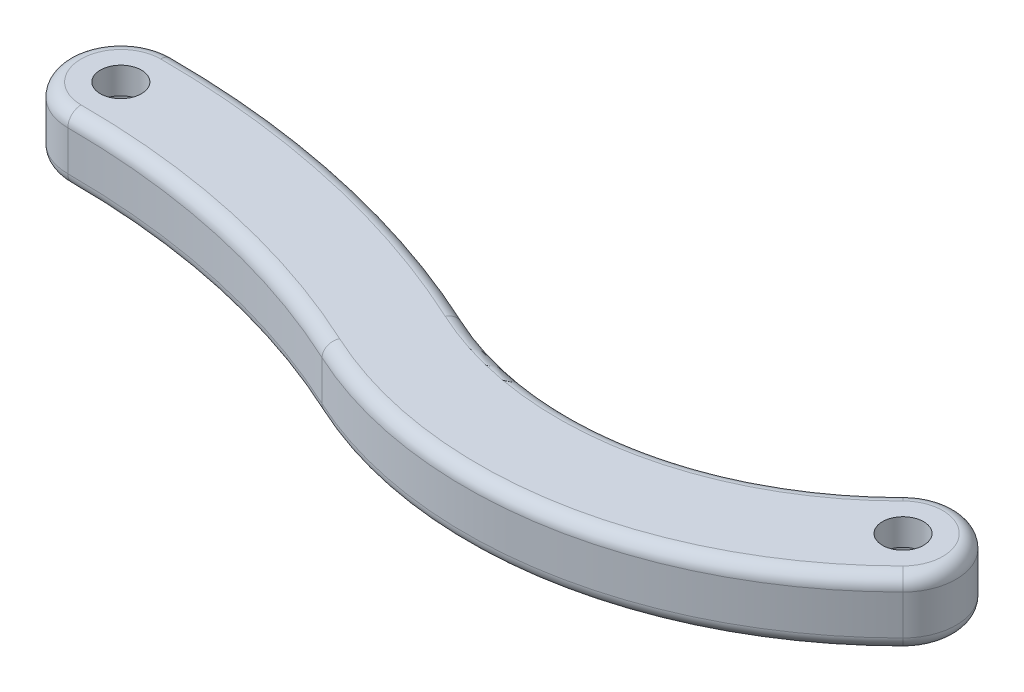
ISO-10303-21;
HEADER;
FILE_DESCRIPTION(('STEP AP214'),'2;1');
FILE_NAME('part.step','',(''),(''),'','','');
FILE_SCHEMA(('AUTOMOTIVE_DESIGN { 1 0 10303 214 1 1 1 1 }'));
ENDSEC;
DATA;
#1=APPLICATION_CONTEXT('core data for automotive mechanical design processes');
#2=APPLICATION_PROTOCOL_DEFINITION('international standard','automotive_design',2000,#1);
#3=PRODUCT_CONTEXT('',#1,'mechanical');
#4=PRODUCT('Part','Part','',(#3));
#5=PRODUCT_RELATED_PRODUCT_CATEGORY('part','',(#4));
#6=PRODUCT_DEFINITION_FORMATION('','',#4);
#7=PRODUCT_DEFINITION_CONTEXT('part definition',#1,'design');
#8=PRODUCT_DEFINITION('design','',#6,#7);
#9=PRODUCT_DEFINITION_SHAPE('','',#8);
#10=(LENGTH_UNIT() NAMED_UNIT(*) SI_UNIT(.MILLI.,.METRE.));
#11=(NAMED_UNIT(*) PLANE_ANGLE_UNIT() SI_UNIT($,.RADIAN.));
#12=(NAMED_UNIT(*) SI_UNIT($,.STERADIAN.) SOLID_ANGLE_UNIT());
#13=UNCERTAINTY_MEASURE_WITH_UNIT(LENGTH_MEASURE(1.E-05),#10,'distance_accuracy_value','');
#14=(GEOMETRIC_REPRESENTATION_CONTEXT(3) GLOBAL_UNCERTAINTY_ASSIGNED_CONTEXT((#13)) GLOBAL_UNIT_ASSIGNED_CONTEXT((#10,
#11,#12)) REPRESENTATION_CONTEXT('',''));
#15=CARTESIAN_POINT('',(0.,0.,0.));
#16=DIRECTION('',(0.,0.,1.));
#17=DIRECTION('',(1.,0.,0.));
#18=AXIS2_PLACEMENT_3D('',#15,#16,#17);
#19=CARTESIAN_POINT('',(-29.5,5.,0.));
#20=DIRECTION('',(0.,-1.,0.));
#21=DIRECTION('',(0.,0.,-1.));
#22=AXIS2_PLACEMENT_3D('',#19,#20,#21);
#23=CYLINDRICAL_SURFACE('',#22,1.55);
#24=CARTESIAN_POINT('',(-29.5,5.,0.));
#25=DIRECTION('',(0.,1.,0.));
#26=DIRECTION('',(0.,0.,1.));
#27=AXIS2_PLACEMENT_3D('',#24,#25,#26);
#28=CIRCLE('',#27,1.55);
#29=CARTESIAN_POINT('',(-29.5,5.,1.55));
#30=VERTEX_POINT('',#29);
#31=EDGE_CURVE('E237',#30,#30,#28,.T.);
#32=ORIENTED_EDGE('',*,*,#31,.T.);
#33=EDGE_LOOP('',(#32));
#34=FACE_BOUND('',#33,.T.);
#35=CARTESIAN_POINT('',(-29.5,3.,0.));
#36=DIRECTION('',(0.,-1.,0.));
#37=DIRECTION('',(0.,0.,-1.));
#38=AXIS2_PLACEMENT_3D('',#35,#36,#37);
#39=CIRCLE('',#38,1.55);
#40=CARTESIAN_POINT('',(-29.5,3.,-1.55));
#41=VERTEX_POINT('',#40);
#42=EDGE_CURVE('E37',#41,#41,#39,.T.);
#43=ORIENTED_EDGE('',*,*,#42,.T.);
#44=EDGE_LOOP('',(#43));
#45=FACE_BOUND('',#44,.T.);
#46=ADVANCED_FACE('F33',(#34,#45),#23,.F.);
#47=CARTESIAN_POINT('',(29.5,5.,0.));
#48=DIRECTION('',(0.,-1.,0.));
#49=DIRECTION('',(0.,0.,-1.));
#50=AXIS2_PLACEMENT_3D('',#47,#48,#49);
#51=CYLINDRICAL_SURFACE('',#50,1.55);
#52=CARTESIAN_POINT('',(29.5,5.,0.));
#53=DIRECTION('',(0.,1.,0.));
#54=DIRECTION('',(0.,0.,1.));
#55=AXIS2_PLACEMENT_3D('',#52,#53,#54);
#56=CIRCLE('',#55,1.55);
#57=CARTESIAN_POINT('',(29.5,5.,1.55));
#58=VERTEX_POINT('',#57);
#59=EDGE_CURVE('E201',#58,#58,#56,.T.);
#60=ORIENTED_EDGE('',*,*,#59,.T.);
#61=EDGE_LOOP('',(#60));
#62=FACE_BOUND('',#61,.T.);
#63=CARTESIAN_POINT('',(29.5,3.,0.));
#64=DIRECTION('',(0.,-1.,0.));
#65=DIRECTION('',(0.,0.,-1.));
#66=AXIS2_PLACEMENT_3D('',#63,#64,#65);
#67=CIRCLE('',#66,1.55);
#68=CARTESIAN_POINT('',(29.5,3.,-1.55));
#69=VERTEX_POINT('',#68);
#70=EDGE_CURVE('E215',#69,#69,#67,.T.);
#71=ORIENTED_EDGE('',*,*,#70,.T.);
#72=EDGE_LOOP('',(#71));
#73=FACE_BOUND('',#72,.T.);
#74=ADVANCED_FACE('F325',(#62,#73),#51,.F.);
#75=CARTESIAN_POINT('',(-10.253048327205,5.,20.9834913295184));
#76=DIRECTION('',(0.,-1.,0.));
#77=DIRECTION('',(0.,0.,-1.));
#78=AXIS2_PLACEMENT_3D('',#75,#76,#77);
#79=PLANE('',#78);
#80=CARTESIAN_POINT('',(8.99390334559,5.,-20.5060966544098));
#81=DIRECTION('',(0.,-1.,0.));
#82=DIRECTION('',(0.,0.,-1.));
#83=AXIS2_PLACEMENT_3D('',#80,#81,#82);
#84=CIRCLE('',#83,32.);
#85=CARTESIAN_POINT('',(-4.47240735810798,5.,8.52248367655837));
#86=VERTEX_POINT('',#85);
#87=CARTESIAN_POINT('',(31.6213203435597,5.,2.12132034355962));
#88=VERTEX_POINT('',#87);
#89=EDGE_CURVE('E151',#86,#88,#84,.F.);
#90=ORIENTED_EDGE('',*,*,#89,.T.);
#91=CARTESIAN_POINT('',(29.5,5.,0.));
#92=DIRECTION('',(0.,-1.,0.));
#93=DIRECTION('',(0.,0.,-1.));
#94=AXIS2_PLACEMENT_3D('',#91,#92,#93);
#95=CIRCLE('',#94,3.);
#96=CARTESIAN_POINT('',(27.3786796564403,5.,-2.12132034355963));
#97=VERTEX_POINT('',#96);
#98=EDGE_CURVE('E130',#88,#97,#95,.F.);
#99=ORIENTED_EDGE('',*,*,#98,.T.);
#100=CARTESIAN_POINT('',(8.99390334558998,5.,-20.5060966544098));
#101=DIRECTION('',(0.,-1.,0.));
#102=DIRECTION('',(0.,0.,-1.));
#103=AXIS2_PLACEMENT_3D('',#100,#101,#102);
#104=CIRCLE('',#103,26.);
#105=CARTESIAN_POINT('',(-1.94747410116464,5.,3.07962486450185));
#106=VERTEX_POINT('',#105);
#107=EDGE_CURVE('E139',#97,#106,#104,.T.);
#108=ORIENTED_EDGE('',*,*,#107,.T.);
#109=CARTESIAN_POINT('',(-29.5,5.,62.4730793134467));
#110=DIRECTION('',(0.,-1.,0.));
#111=DIRECTION('',(0.,0.,-1.));
#112=AXIS2_PLACEMENT_3D('',#109,#110,#111);
#113=CIRCLE('',#112,65.4730793134467);
#114=CARTESIAN_POINT('',(-29.5,5.,-3.));
#115=VERTEX_POINT('',#114);
#116=EDGE_CURVE('E145',#106,#115,#113,.F.);
#117=ORIENTED_EDGE('',*,*,#116,.T.);
#118=CARTESIAN_POINT('',(-29.5,5.,0.));
#119=DIRECTION('',(0.,-1.,0.));
#120=DIRECTION('',(0.,0.,-1.));
#121=AXIS2_PLACEMENT_3D('',#118,#119,#120);
#122=CIRCLE('',#121,3.);
#123=CARTESIAN_POINT('',(-29.5,5.,3.));
#124=VERTEX_POINT('',#123);
#125=EDGE_CURVE('E258',#115,#124,#122,.F.);
#126=ORIENTED_EDGE('',*,*,#125,.T.);
#127=CARTESIAN_POINT('',(-29.5,5.,62.4730793134466));
#128=DIRECTION('',(0.,-1.,0.));
#129=DIRECTION('',(0.,0.,-1.));
#130=AXIS2_PLACEMENT_3D('',#127,#128,#129);
#131=CIRCLE('',#130,59.4730793134466);
#132=EDGE_CURVE('E157',#124,#86,#131,.T.);
#133=ORIENTED_EDGE('',*,*,#132,.T.);
#134=EDGE_LOOP('',(#90,#99,#108,#117,#126,#133));
#135=FACE_BOUND('',#134,.T.);
#136=ORIENTED_EDGE('',*,*,#31,.F.);
#137=EDGE_LOOP('',(#136));
#138=FACE_BOUND('',#137,.T.);
#139=ORIENTED_EDGE('',*,*,#59,.F.);
#140=EDGE_LOOP('',(#139));
#141=FACE_BOUND('',#140,.T.);
#142=ADVANCED_FACE('F148',(#135,#138,#141),#79,.F.);
#143=CARTESIAN_POINT('',(-10.253048327205,0.,20.9834913295184));
#144=DIRECTION('',(0.,-1.,0.));
#145=DIRECTION('',(0.,0.,-1.));
#146=AXIS2_PLACEMENT_3D('',#143,#144,#145);
#147=PLANE('',#146);
#148=CARTESIAN_POINT('',(29.5,0.,0.));
#149=DIRECTION('',(0.,-1.,0.));
#150=DIRECTION('',(0.,0.,-1.));
#151=AXIS2_PLACEMENT_3D('',#148,#149,#150);
#152=CIRCLE('',#151,2.9);
#153=CARTESIAN_POINT('',(29.5,0.,-2.9));
#154=VERTEX_POINT('',#153);
#155=EDGE_CURVE('E222',#154,#154,#152,.T.);
#156=ORIENTED_EDGE('',*,*,#155,.F.);
#157=EDGE_LOOP('',(#156));
#158=FACE_BOUND('',#157,.T.);
#159=CARTESIAN_POINT('',(-29.5,0.,0.));
#160=DIRECTION('',(0.,-1.,0.));
#161=DIRECTION('',(0.,0.,-1.));
#162=AXIS2_PLACEMENT_3D('',#159,#160,#161);
#163=CIRCLE('',#162,2.9);
#164=CARTESIAN_POINT('',(-29.5,0.,-2.89999999999997));
#165=VERTEX_POINT('',#164);
#166=EDGE_CURVE('E232',#165,#165,#163,.T.);
#167=ORIENTED_EDGE('',*,*,#166,.F.);
#168=EDGE_LOOP('',(#167));
#169=FACE_BOUND('',#168,.T.);
#170=CARTESIAN_POINT('',(8.99390334558998,0.,-20.5060966544098));
#171=DIRECTION('',(0.,-1.,0.));
#172=DIRECTION('',(0.,0.,-1.));
#173=AXIS2_PLACEMENT_3D('',#170,#171,#172);
#174=CIRCLE('',#173,26.);
#175=CARTESIAN_POINT('',(-1.94747410116464,0.,3.07962486450185));
#176=VERTEX_POINT('',#175);
#177=CARTESIAN_POINT('',(27.3786796564403,0.,-2.12132034355963));
#178=VERTEX_POINT('',#177);
#179=EDGE_CURVE('E178',#176,#178,#174,.F.);
#180=ORIENTED_EDGE('',*,*,#179,.T.);
#181=CARTESIAN_POINT('',(29.5,0.,0.));
#182=DIRECTION('',(0.,-1.,0.));
#183=DIRECTION('',(0.,0.,-1.));
#184=AXIS2_PLACEMENT_3D('',#181,#182,#183);
#185=CIRCLE('',#184,3.);
#186=CARTESIAN_POINT('',(31.6213203435597,0.,2.12132034355962));
#187=VERTEX_POINT('',#186);
#188=EDGE_CURVE('E187',#178,#187,#185,.T.);
#189=ORIENTED_EDGE('',*,*,#188,.T.);
#190=CARTESIAN_POINT('',(8.99390334559,0.,-20.5060966544098));
#191=DIRECTION('',(0.,-1.,0.));
#192=DIRECTION('',(0.,0.,-1.));
#193=AXIS2_PLACEMENT_3D('',#190,#191,#192);
#194=CIRCLE('',#193,32.);
#195=CARTESIAN_POINT('',(-4.47240735810798,0.,8.52248367655837));
#196=VERTEX_POINT('',#195);
#197=EDGE_CURVE('E57',#187,#196,#194,.T.);
#198=ORIENTED_EDGE('',*,*,#197,.T.);
#199=CARTESIAN_POINT('',(-29.5,0.,62.4730793134466));
#200=DIRECTION('',(0.,-1.,0.));
#201=DIRECTION('',(0.,0.,-1.));
#202=AXIS2_PLACEMENT_3D('',#199,#200,#201);
#203=CIRCLE('',#202,59.4730793134466);
#204=CARTESIAN_POINT('',(-29.5,0.,3.));
#205=VERTEX_POINT('',#204);
#206=EDGE_CURVE('E184',#196,#205,#203,.F.);
#207=ORIENTED_EDGE('',*,*,#206,.T.);
#208=CARTESIAN_POINT('',(-29.5,0.,0.));
#209=DIRECTION('',(0.,-1.,0.));
#210=DIRECTION('',(0.,0.,-1.));
#211=AXIS2_PLACEMENT_3D('',#208,#209,#210);
#212=CIRCLE('',#211,3.);
#213=CARTESIAN_POINT('',(-29.5,0.,-3.));
#214=VERTEX_POINT('',#213);
#215=EDGE_CURVE('E182',#205,#214,#212,.T.);
#216=ORIENTED_EDGE('',*,*,#215,.T.);
#217=CARTESIAN_POINT('',(-29.5,0.,62.4730793134467));
#218=DIRECTION('',(0.,-1.,0.));
#219=DIRECTION('',(0.,0.,-1.));
#220=AXIS2_PLACEMENT_3D('',#217,#218,#219);
#221=CIRCLE('',#220,65.4730793134467);
#222=EDGE_CURVE('E180',#214,#176,#221,.T.);
#223=ORIENTED_EDGE('',*,*,#222,.T.);
#224=EDGE_LOOP('',(#180,#189,#198,#207,#216,#223));
#225=FACE_BOUND('',#224,.T.);
#226=ADVANCED_FACE('F309',(#158,#169,#225),#147,.T.);
#227=CARTESIAN_POINT('',(-29.5,5.,62.4730793134467));
#228=DIRECTION('',(0.,-1.,0.));
#229=DIRECTION('',(0.,0.,-1.));
#230=AXIS2_PLACEMENT_3D('',#227,#228,#229);
#231=CYLINDRICAL_SURFACE('',#230,66.4730793134467);
#232=DIRECTION('',(0.,-1.,0.));
#233=VECTOR('',#232,1.);
#234=CARTESIAN_POINT('',(-29.5,5.,-4.));
#235=LINE('',#234,#233);
#236=CARTESIAN_POINT('',(-29.5,4.,-4.));
#237=VERTEX_POINT('',#236);
#238=CARTESIAN_POINT('',(-29.5,1.,-4.));
#239=VERTEX_POINT('',#238);
#240=EDGE_CURVE('E146',#237,#239,#235,.T.);
#241=ORIENTED_EDGE('',*,*,#240,.F.);
#242=CARTESIAN_POINT('',(-29.5,4.,62.4730793134467));
#243=DIRECTION('',(0.,-1.,0.));
#244=DIRECTION('',(0.,0.,-1.));
#245=AXIS2_PLACEMENT_3D('',#242,#243,#244);
#246=CIRCLE('',#245,66.4730793134467);
#247=CARTESIAN_POINT('',(-1.52665189167408,4.,2.17248172915909));
#248=VERTEX_POINT('',#247);
#249=EDGE_CURVE('E176',#237,#248,#246,.T.);
#250=ORIENTED_EDGE('',*,*,#249,.T.);
#251=DIRECTION('',(0.,-1.,0.));
#252=VECTOR('',#251,1.);
#253=CARTESIAN_POINT('',(-1.52665189167408,5.,2.17248172915909));
#254=LINE('',#253,#252);
#255=CARTESIAN_POINT('',(-1.52665189167408,1.,2.17248172915909));
#256=VERTEX_POINT('',#255);
#257=EDGE_CURVE('E240',#248,#256,#254,.T.);
#258=ORIENTED_EDGE('',*,*,#257,.T.);
#259=CARTESIAN_POINT('',(-29.5,1.,62.4730793134467));
#260=DIRECTION('',(0.,-1.,0.));
#261=DIRECTION('',(0.,0.,-1.));
#262=AXIS2_PLACEMENT_3D('',#259,#260,#261);
#263=CIRCLE('',#262,66.4730793134467);
#264=EDGE_CURVE('E174',#256,#239,#263,.F.);
#265=ORIENTED_EDGE('',*,*,#264,.T.);
#266=EDGE_LOOP('',(#241,#250,#258,#265));
#267=FACE_BOUND('',#266,.T.);
#268=ADVANCED_FACE('F300',(#267),#231,.T.);
#269=CARTESIAN_POINT('',(-29.5,5.,0.));
#270=DIRECTION('',(0.,-1.,0.));
#271=DIRECTION('',(0.,0.,-1.));
#272=AXIS2_PLACEMENT_3D('',#269,#270,#271);
#273=CYLINDRICAL_SURFACE('',#272,4.);
#274=DIRECTION('',(0.,-1.,0.));
#275=VECTOR('',#274,1.);
#276=CARTESIAN_POINT('',(-29.5,5.,4.));
#277=LINE('',#276,#275);
#278=CARTESIAN_POINT('',(-29.5,4.,4.));
#279=VERTEX_POINT('',#278);
#280=CARTESIAN_POINT('',(-29.5,1.,4.));
#281=VERTEX_POINT('',#280);
#282=EDGE_CURVE('E252',#279,#281,#277,.T.);
#283=ORIENTED_EDGE('',*,*,#282,.F.);
#284=CARTESIAN_POINT('',(-29.5,4.,0.));
#285=DIRECTION('',(0.,-1.,0.));
#286=DIRECTION('',(0.,0.,-1.));
#287=AXIS2_PLACEMENT_3D('',#284,#285,#286);
#288=CIRCLE('',#287,4.);
#289=EDGE_CURVE('E172',#279,#237,#288,.T.);
#290=ORIENTED_EDGE('',*,*,#289,.T.);
#291=ORIENTED_EDGE('',*,*,#240,.T.);
#292=CARTESIAN_POINT('',(-29.5,1.,0.));
#293=DIRECTION('',(0.,-1.,0.));
#294=DIRECTION('',(0.,0.,-1.));
#295=AXIS2_PLACEMENT_3D('',#292,#293,#294);
#296=CIRCLE('',#295,4.);
#297=EDGE_CURVE('E170',#239,#281,#296,.F.);
#298=ORIENTED_EDGE('',*,*,#297,.T.);
#299=EDGE_LOOP('',(#283,#290,#291,#298));
#300=FACE_BOUND('',#299,.T.);
#301=ADVANCED_FACE('F298',(#300),#273,.T.);
#302=CARTESIAN_POINT('',(-29.5,5.,62.4730793134466));
#303=DIRECTION('',(0.,-1.,0.));
#304=DIRECTION('',(0.,0.,-1.));
#305=AXIS2_PLACEMENT_3D('',#302,#303,#304);
#306=CYLINDRICAL_SURFACE('',#305,58.4730793134466);
#307=DIRECTION('',(0.,-1.,0.));
#308=VECTOR('',#307,1.);
#309=CARTESIAN_POINT('',(-4.89322956759855,5.,9.42962681190113));
#310=LINE('',#309,#308);
#311=CARTESIAN_POINT('',(-4.89322956759855,4.,9.42962681190113));
#312=VERTEX_POINT('',#311);
#313=CARTESIAN_POINT('',(-4.89322956759855,1.,9.42962681190113));
#314=VERTEX_POINT('',#313);
#315=EDGE_CURVE('E249',#312,#314,#310,.T.);
#316=ORIENTED_EDGE('',*,*,#315,.F.);
#317=CARTESIAN_POINT('',(-29.5,4.,62.4730793134466));
#318=DIRECTION('',(0.,-1.,0.));
#319=DIRECTION('',(0.,0.,-1.));
#320=AXIS2_PLACEMENT_3D('',#317,#318,#319);
#321=CIRCLE('',#320,58.4730793134466);
#322=EDGE_CURVE('E168',#312,#279,#321,.F.);
#323=ORIENTED_EDGE('',*,*,#322,.T.);
#324=ORIENTED_EDGE('',*,*,#282,.T.);
#325=CARTESIAN_POINT('',(-29.5,1.,62.4730793134466));
#326=DIRECTION('',(0.,-1.,0.));
#327=DIRECTION('',(0.,0.,-1.));
#328=AXIS2_PLACEMENT_3D('',#325,#326,#327);
#329=CIRCLE('',#328,58.4730793134466);
#330=EDGE_CURVE('E166',#281,#314,#329,.T.);
#331=ORIENTED_EDGE('',*,*,#330,.T.);
#332=EDGE_LOOP('',(#316,#323,#324,#331));
#333=FACE_BOUND('',#332,.T.);
#334=ADVANCED_FACE('F315',(#333),#306,.F.);
#335=CARTESIAN_POINT('',(8.99390334559,5.,-20.5060966544098));
#336=DIRECTION('',(0.,-1.,0.));
#337=DIRECTION('',(0.,0.,-1.));
#338=AXIS2_PLACEMENT_3D('',#335,#336,#337);
#339=CYLINDRICAL_SURFACE('',#338,33.);
#340=DIRECTION('',(0.,-1.,0.));
#341=VECTOR('',#340,1.);
#342=CARTESIAN_POINT('',(32.3284271247462,5.,2.82842712474617));
#343=LINE('',#342,#341);
#344=CARTESIAN_POINT('',(32.3284271247462,4.,2.82842712474617));
#345=VERTEX_POINT('',#344);
#346=CARTESIAN_POINT('',(32.3284271247462,1.,2.82842712474617));
#347=VERTEX_POINT('',#346);
#348=EDGE_CURVE('E246',#345,#347,#343,.T.);
#349=ORIENTED_EDGE('',*,*,#348,.F.);
#350=CARTESIAN_POINT('',(8.99390334559,4.,-20.5060966544098));
#351=DIRECTION('',(0.,-1.,0.));
#352=DIRECTION('',(0.,0.,-1.));
#353=AXIS2_PLACEMENT_3D('',#350,#351,#352);
#354=CIRCLE('',#353,33.);
#355=EDGE_CURVE('E164',#345,#312,#354,.T.);
#356=ORIENTED_EDGE('',*,*,#355,.T.);
#357=ORIENTED_EDGE('',*,*,#315,.T.);
#358=CARTESIAN_POINT('',(8.99390334559,1.,-20.5060966544098));
#359=DIRECTION('',(0.,-1.,0.));
#360=DIRECTION('',(0.,0.,-1.));
#361=AXIS2_PLACEMENT_3D('',#358,#359,#360);
#362=CIRCLE('',#361,33.);
#363=EDGE_CURVE('E162',#314,#347,#362,.F.);
#364=ORIENTED_EDGE('',*,*,#363,.T.);
#365=EDGE_LOOP('',(#349,#356,#357,#364));
#366=FACE_BOUND('',#365,.T.);
#367=ADVANCED_FACE('F275',(#366),#339,.T.);
#368=CARTESIAN_POINT('',(29.5,5.,0.));
#369=DIRECTION('',(0.,-1.,0.));
#370=DIRECTION('',(0.,0.,-1.));
#371=AXIS2_PLACEMENT_3D('',#368,#369,#370);
#372=CYLINDRICAL_SURFACE('',#371,4.);
#373=DIRECTION('',(0.,-1.,0.));
#374=VECTOR('',#373,1.);
#375=CARTESIAN_POINT('',(26.6715728752538,5.,-2.82842712474617));
#376=LINE('',#375,#374);
#377=CARTESIAN_POINT('',(26.6715728752538,4.,-2.82842712474617));
#378=VERTEX_POINT('',#377);
#379=CARTESIAN_POINT('',(26.6715728752538,1.,-2.82842712474617));
#380=VERTEX_POINT('',#379);
#381=EDGE_CURVE('E243',#378,#380,#376,.T.);
#382=ORIENTED_EDGE('',*,*,#381,.F.);
#383=CARTESIAN_POINT('',(29.5,4.,0.));
#384=DIRECTION('',(0.,-1.,0.));
#385=DIRECTION('',(0.,0.,-1.));
#386=AXIS2_PLACEMENT_3D('',#383,#384,#385);
#387=CIRCLE('',#386,4.);
#388=EDGE_CURVE('E132',#378,#345,#387,.T.);
#389=ORIENTED_EDGE('',*,*,#388,.T.);
#390=ORIENTED_EDGE('',*,*,#348,.T.);
#391=CARTESIAN_POINT('',(29.5,1.,0.));
#392=DIRECTION('',(0.,-1.,0.));
#393=DIRECTION('',(0.,0.,-1.));
#394=AXIS2_PLACEMENT_3D('',#391,#392,#393);
#395=CIRCLE('',#394,4.);
#396=EDGE_CURVE('E153',#347,#380,#395,.F.);
#397=ORIENTED_EDGE('',*,*,#396,.T.);
#398=EDGE_LOOP('',(#382,#389,#390,#397));
#399=FACE_BOUND('',#398,.T.);
#400=ADVANCED_FACE('F274',(#399),#372,.T.);
#401=CARTESIAN_POINT('',(8.99390334558998,5.,-20.5060966544098));
#402=DIRECTION('',(0.,-1.,0.));
#403=DIRECTION('',(0.,0.,-1.));
#404=AXIS2_PLACEMENT_3D('',#401,#402,#403);
#405=CYLINDRICAL_SURFACE('',#404,25.);
#406=ORIENTED_EDGE('',*,*,#257,.F.);
#407=CARTESIAN_POINT('',(8.99390334558998,4.,-20.5060966544098));
#408=DIRECTION('',(0.,-1.,0.));
#409=DIRECTION('',(0.,0.,-1.));
#410=AXIS2_PLACEMENT_3D('',#407,#408,#409);
#411=CIRCLE('',#410,25.);
#412=EDGE_CURVE('E11',#248,#378,#411,.F.);
#413=ORIENTED_EDGE('',*,*,#412,.T.);
#414=ORIENTED_EDGE('',*,*,#381,.T.);
#415=CARTESIAN_POINT('',(8.99390334558998,1.,-20.5060966544098));
#416=DIRECTION('',(0.,-1.,0.));
#417=DIRECTION('',(0.,0.,-1.));
#418=AXIS2_PLACEMENT_3D('',#415,#416,#417);
#419=CIRCLE('',#418,25.);
#420=EDGE_CURVE('E42',#380,#256,#419,.T.);
#421=ORIENTED_EDGE('',*,*,#420,.T.);
#422=EDGE_LOOP('',(#406,#413,#414,#421));
#423=FACE_BOUND('',#422,.T.);
#424=ADVANCED_FACE('F285',(#423),#405,.F.);
#425=CARTESIAN_POINT('',(-29.5,4.,0.));
#426=DIRECTION('',(0.,-1.,0.));
#427=DIRECTION('',(0.,0.,-1.));
#428=AXIS2_PLACEMENT_3D('',#425,#426,#427);
#429=TOROIDAL_SURFACE('',#428,3.,1.);
#430=CARTESIAN_POINT('',(-29.5,4.,-3.));
#431=DIRECTION('',(1.,0.,0.));
#432=DIRECTION('',(0.,0.,-1.));
#433=AXIS2_PLACEMENT_3D('',#430,#431,#432);
#434=CIRCLE('',#433,1.);
#435=EDGE_CURVE('E195',#237,#115,#434,.T.);
#436=ORIENTED_EDGE('',*,*,#435,.F.);
#437=ORIENTED_EDGE('',*,*,#289,.F.);
#438=CARTESIAN_POINT('',(-29.5,4.,3.));
#439=DIRECTION('',(1.,0.,0.));
#440=DIRECTION('',(0.,0.,-1.));
#441=AXIS2_PLACEMENT_3D('',#438,#439,#440);
#442=CIRCLE('',#441,1.);
#443=EDGE_CURVE('E198',#124,#279,#442,.T.);
#444=ORIENTED_EDGE('',*,*,#443,.F.);
#445=ORIENTED_EDGE('',*,*,#125,.F.);
#446=EDGE_LOOP('',(#436,#437,#444,#445));
#447=FACE_BOUND('',#446,.T.);
#448=ADVANCED_FACE('F293',(#447),#429,.T.);
#449=CARTESIAN_POINT('',(-29.5,4.,62.4730793134466));
#450=DIRECTION('',(0.,-1.,0.));
#451=DIRECTION('',(0.,0.,-1.));
#452=AXIS2_PLACEMENT_3D('',#449,#450,#451);
#453=TOROIDAL_SURFACE('',#452,59.4730793134466,1.);
#454=ORIENTED_EDGE('',*,*,#443,.T.);
#455=ORIENTED_EDGE('',*,*,#322,.F.);
#456=CARTESIAN_POINT('',(-4.47240735810798,4.,8.52248367655837));
#457=DIRECTION('',(0.907143135342753,0.,0.420822209490563));
#458=DIRECTION('',(0.420822209490563,0.,-0.907143135342754));
#459=AXIS2_PLACEMENT_3D('',#456,#457,#458);
#460=CIRCLE('',#459,1.);
#461=EDGE_CURVE('E192',#86,#312,#460,.T.);
#462=ORIENTED_EDGE('',*,*,#461,.F.);
#463=ORIENTED_EDGE('',*,*,#132,.F.);
#464=EDGE_LOOP('',(#454,#455,#462,#463));
#465=FACE_BOUND('',#464,.T.);
#466=ADVANCED_FACE('F265',(#465),#453,.T.);
#467=CARTESIAN_POINT('',(-29.5,4.,62.4730793134467));
#468=DIRECTION('',(0.,-1.,0.));
#469=DIRECTION('',(0.,0.,-1.));
#470=AXIS2_PLACEMENT_3D('',#467,#468,#469);
#471=TOROIDAL_SURFACE('',#470,65.4730793134467,1.);
#472=ORIENTED_EDGE('',*,*,#435,.T.);
#473=ORIENTED_EDGE('',*,*,#116,.F.);
#474=CARTESIAN_POINT('',(-1.94747410116463,4.,3.07962486450183));
#475=DIRECTION('',(0.907143135342754,0.,0.420822209490561));
#476=DIRECTION('',(0.420822209490561,0.,-0.907143135342754));
#477=AXIS2_PLACEMENT_3D('',#474,#475,#476);
#478=CIRCLE('',#477,1.);
#479=EDGE_CURVE('E142',#248,#106,#478,.T.);
#480=ORIENTED_EDGE('',*,*,#479,.F.);
#481=ORIENTED_EDGE('',*,*,#249,.F.);
#482=EDGE_LOOP('',(#472,#473,#480,#481));
#483=FACE_BOUND('',#482,.T.);
#484=ADVANCED_FACE('F290',(#483),#471,.T.);
#485=CARTESIAN_POINT('',(8.99390334559,4.,-20.5060966544098));
#486=DIRECTION('',(0.,-1.,0.));
#487=DIRECTION('',(0.,0.,-1.));
#488=AXIS2_PLACEMENT_3D('',#485,#486,#487);
#489=TOROIDAL_SURFACE('',#488,32.,1.);
#490=ORIENTED_EDGE('',*,*,#461,.T.);
#491=ORIENTED_EDGE('',*,*,#355,.F.);
#492=CARTESIAN_POINT('',(31.6213203435597,4.,2.12132034355962));
#493=DIRECTION('',(0.707106781186543,0.,-0.707106781186552));
#494=DIRECTION('',(-0.707106781186552,0.,-0.707106781186543));
#495=AXIS2_PLACEMENT_3D('',#492,#493,#494);
#496=CIRCLE('',#495,1.);
#497=EDGE_CURVE('E135',#88,#345,#496,.T.);
#498=ORIENTED_EDGE('',*,*,#497,.F.);
#499=ORIENTED_EDGE('',*,*,#89,.F.);
#500=EDGE_LOOP('',(#490,#491,#498,#499));
#501=FACE_BOUND('',#500,.T.);
#502=ADVANCED_FACE('F268',(#501),#489,.T.);
#503=CARTESIAN_POINT('',(8.99390334558998,4.,-20.5060966544098));
#504=DIRECTION('',(0.,-1.,0.));
#505=DIRECTION('',(0.,0.,-1.));
#506=AXIS2_PLACEMENT_3D('',#503,#504,#505);
#507=TOROIDAL_SURFACE('',#506,26.,1.);
#508=ORIENTED_EDGE('',*,*,#479,.T.);
#509=ORIENTED_EDGE('',*,*,#107,.F.);
#510=CARTESIAN_POINT('',(27.3786796564403,4.,-2.12132034355963));
#511=DIRECTION('',(0.707106781186543,0.,-0.707106781186552));
#512=DIRECTION('',(-0.707106781186552,0.,-0.707106781186543));
#513=AXIS2_PLACEMENT_3D('',#510,#511,#512);
#514=CIRCLE('',#513,1.);
#515=EDGE_CURVE('E126',#378,#97,#514,.T.);
#516=ORIENTED_EDGE('',*,*,#515,.F.);
#517=ORIENTED_EDGE('',*,*,#412,.F.);
#518=EDGE_LOOP('',(#508,#509,#516,#517));
#519=FACE_BOUND('',#518,.T.);
#520=ADVANCED_FACE('F140',(#519),#507,.T.);
#521=CARTESIAN_POINT('',(29.5,4.,0.));
#522=DIRECTION('',(0.,-1.,0.));
#523=DIRECTION('',(0.,0.,-1.));
#524=AXIS2_PLACEMENT_3D('',#521,#522,#523);
#525=TOROIDAL_SURFACE('',#524,3.,1.);
#526=ORIENTED_EDGE('',*,*,#497,.T.);
#527=ORIENTED_EDGE('',*,*,#388,.F.);
#528=ORIENTED_EDGE('',*,*,#515,.T.);
#529=ORIENTED_EDGE('',*,*,#98,.F.);
#530=EDGE_LOOP('',(#526,#527,#528,#529));
#531=FACE_BOUND('',#530,.T.);
#532=ADVANCED_FACE('F128',(#531),#525,.T.);
#533=CARTESIAN_POINT('',(-29.5,1.,0.));
#534=DIRECTION('',(0.,-1.,0.));
#535=DIRECTION('',(0.,0.,-1.));
#536=AXIS2_PLACEMENT_3D('',#533,#534,#535);
#537=TOROIDAL_SURFACE('',#536,3.,1.);
#538=CARTESIAN_POINT('',(-29.5,1.,-3.));
#539=DIRECTION('',(1.,0.,0.));
#540=DIRECTION('',(0.,0.,-1.));
#541=AXIS2_PLACEMENT_3D('',#538,#539,#540);
#542=CIRCLE('',#541,1.);
#543=EDGE_CURVE('E211',#214,#239,#542,.T.);
#544=ORIENTED_EDGE('',*,*,#543,.F.);
#545=ORIENTED_EDGE('',*,*,#215,.F.);
#546=CARTESIAN_POINT('',(-29.5,1.,3.));
#547=DIRECTION('',(1.,0.,0.));
#548=DIRECTION('',(0.,0.,-1.));
#549=AXIS2_PLACEMENT_3D('',#546,#547,#548);
#550=CIRCLE('',#549,1.);
#551=EDGE_CURVE('E136',#281,#205,#550,.T.);
#552=ORIENTED_EDGE('',*,*,#551,.F.);
#553=ORIENTED_EDGE('',*,*,#297,.F.);
#554=EDGE_LOOP('',(#544,#545,#552,#553));
#555=FACE_BOUND('',#554,.T.);
#556=ADVANCED_FACE('F35',(#555),#537,.T.);
#557=CARTESIAN_POINT('',(-29.5,1.,62.4730793134466));
#558=DIRECTION('',(0.,-1.,0.));
#559=DIRECTION('',(0.,0.,-1.));
#560=AXIS2_PLACEMENT_3D('',#557,#558,#559);
#561=TOROIDAL_SURFACE('',#560,59.4730793134466,1.);
#562=ORIENTED_EDGE('',*,*,#551,.T.);
#563=ORIENTED_EDGE('',*,*,#206,.F.);
#564=CARTESIAN_POINT('',(-4.47240735810799,1.,8.52248367655838));
#565=DIRECTION('',(0.907143135342754,0.,0.420822209490562));
#566=DIRECTION('',(0.420822209490562,0.,-0.907143135342754));
#567=AXIS2_PLACEMENT_3D('',#564,#565,#566);
#568=CIRCLE('',#567,1.);
#569=EDGE_CURVE('E208',#314,#196,#568,.T.);
#570=ORIENTED_EDGE('',*,*,#569,.F.);
#571=ORIENTED_EDGE('',*,*,#330,.F.);
#572=EDGE_LOOP('',(#562,#563,#570,#571));
#573=FACE_BOUND('',#572,.T.);
#574=ADVANCED_FACE('F317',(#573),#561,.T.);
#575=CARTESIAN_POINT('',(-29.5,1.,62.4730793134467));
#576=DIRECTION('',(0.,-1.,0.));
#577=DIRECTION('',(0.,0.,-1.));
#578=AXIS2_PLACEMENT_3D('',#575,#576,#577);
#579=TOROIDAL_SURFACE('',#578,65.4730793134467,1.);
#580=ORIENTED_EDGE('',*,*,#543,.T.);
#581=ORIENTED_EDGE('',*,*,#264,.F.);
#582=CARTESIAN_POINT('',(-1.94747410116463,1.,3.07962486450183));
#583=DIRECTION('',(0.907143135342754,0.,0.420822209490561));
#584=DIRECTION('',(0.420822209490561,0.,-0.907143135342754));
#585=AXIS2_PLACEMENT_3D('',#582,#583,#584);
#586=CIRCLE('',#585,1.);
#587=EDGE_CURVE('E205',#176,#256,#586,.T.);
#588=ORIENTED_EDGE('',*,*,#587,.F.);
#589=ORIENTED_EDGE('',*,*,#222,.F.);
#590=EDGE_LOOP('',(#580,#581,#588,#589));
#591=FACE_BOUND('',#590,.T.);
#592=ADVANCED_FACE('F303',(#591),#579,.T.);
#593=CARTESIAN_POINT('',(8.99390334559,1.,-20.5060966544098));
#594=DIRECTION('',(0.,-1.,0.));
#595=DIRECTION('',(0.,0.,-1.));
#596=AXIS2_PLACEMENT_3D('',#593,#594,#595);
#597=TOROIDAL_SURFACE('',#596,32.,1.);
#598=ORIENTED_EDGE('',*,*,#569,.T.);
#599=ORIENTED_EDGE('',*,*,#197,.F.);
#600=CARTESIAN_POINT('',(31.6213203435597,1.,2.12132034355962));
#601=DIRECTION('',(0.707106781186543,0.,-0.707106781186552));
#602=DIRECTION('',(-0.707106781186552,0.,-0.707106781186543));
#603=AXIS2_PLACEMENT_3D('',#600,#601,#602);
#604=CIRCLE('',#603,1.);
#605=EDGE_CURVE('E50',#347,#187,#604,.T.);
#606=ORIENTED_EDGE('',*,*,#605,.F.);
#607=ORIENTED_EDGE('',*,*,#363,.F.);
#608=EDGE_LOOP('',(#598,#599,#606,#607));
#609=FACE_BOUND('',#608,.T.);
#610=ADVANCED_FACE('F279',(#609),#597,.T.);
#611=CARTESIAN_POINT('',(8.99390334558998,1.,-20.5060966544098));
#612=DIRECTION('',(0.,-1.,0.));
#613=DIRECTION('',(0.,0.,-1.));
#614=AXIS2_PLACEMENT_3D('',#611,#612,#613);
#615=TOROIDAL_SURFACE('',#614,26.,1.);
#616=ORIENTED_EDGE('',*,*,#587,.T.);
#617=ORIENTED_EDGE('',*,*,#420,.F.);
#618=CARTESIAN_POINT('',(27.3786796564403,1.,-2.12132034355963));
#619=DIRECTION('',(0.707106781186544,0.,-0.707106781186551));
#620=DIRECTION('',(-0.707106781186551,0.,-0.707106781186544));
#621=AXIS2_PLACEMENT_3D('',#618,#619,#620);
#622=CIRCLE('',#621,1.);
#623=EDGE_CURVE('E202',#178,#380,#622,.T.);
#624=ORIENTED_EDGE('',*,*,#623,.F.);
#625=ORIENTED_EDGE('',*,*,#179,.F.);
#626=EDGE_LOOP('',(#616,#617,#624,#625));
#627=FACE_BOUND('',#626,.T.);
#628=ADVANCED_FACE('F308',(#627),#615,.T.);
#629=CARTESIAN_POINT('',(29.5,1.,0.));
#630=DIRECTION('',(0.,-1.,0.));
#631=DIRECTION('',(0.,0.,-1.));
#632=AXIS2_PLACEMENT_3D('',#629,#630,#631);
#633=TOROIDAL_SURFACE('',#632,3.,1.);
#634=ORIENTED_EDGE('',*,*,#605,.T.);
#635=ORIENTED_EDGE('',*,*,#188,.F.);
#636=ORIENTED_EDGE('',*,*,#623,.T.);
#637=ORIENTED_EDGE('',*,*,#396,.F.);
#638=EDGE_LOOP('',(#634,#635,#636,#637));
#639=FACE_BOUND('',#638,.T.);
#640=ADVANCED_FACE('F280',(#639),#633,.T.);
#641=CARTESIAN_POINT('',(29.5,3.,0.));
#642=DIRECTION('',(0.,-1.,0.));
#643=DIRECTION('',(0.,0.,-1.));
#644=AXIS2_PLACEMENT_3D('',#641,#642,#643);
#645=CYLINDRICAL_SURFACE('',#644,2.9);
#646=CARTESIAN_POINT('',(29.5,3.,0.));
#647=DIRECTION('',(0.,-1.,0.));
#648=DIRECTION('',(0.,0.,-1.));
#649=AXIS2_PLACEMENT_3D('',#646,#647,#648);
#650=CIRCLE('',#649,2.9);
#651=CARTESIAN_POINT('',(29.5,3.,-2.9));
#652=VERTEX_POINT('',#651);
#653=EDGE_CURVE('E217',#652,#652,#650,.T.);
#654=ORIENTED_EDGE('',*,*,#653,.F.);
#655=EDGE_LOOP('',(#654));
#656=FACE_BOUND('',#655,.T.);
#657=ORIENTED_EDGE('',*,*,#155,.T.);
#658=EDGE_LOOP('',(#657));
#659=FACE_BOUND('',#658,.T.);
#660=ADVANCED_FACE('F367',(#656,#659),#645,.F.);
#661=CARTESIAN_POINT('',(29.5,3.,0.));
#662=DIRECTION('',(0.,-1.,0.));
#663=DIRECTION('',(0.,0.,-1.));
#664=AXIS2_PLACEMENT_3D('',#661,#662,#663);
#665=PLANE('',#664);
#666=ORIENTED_EDGE('',*,*,#70,.F.);
#667=EDGE_LOOP('',(#666));
#668=FACE_BOUND('',#667,.T.);
#669=ORIENTED_EDGE('',*,*,#653,.T.);
#670=EDGE_LOOP('',(#669));
#671=FACE_BOUND('',#670,.T.);
#672=ADVANCED_FACE('F389',(#668,#671),#665,.T.);
#673=CARTESIAN_POINT('',(-29.5,3.,0.));
#674=DIRECTION('',(0.,-1.,0.));
#675=DIRECTION('',(0.,0.,-1.));
#676=AXIS2_PLACEMENT_3D('',#673,#674,#675);
#677=CYLINDRICAL_SURFACE('',#676,2.9);
#678=CARTESIAN_POINT('',(-29.5,3.,0.));
#679=DIRECTION('',(0.,-1.,0.));
#680=DIRECTION('',(0.,0.,-1.));
#681=AXIS2_PLACEMENT_3D('',#678,#679,#680);
#682=CIRCLE('',#681,2.9);
#683=CARTESIAN_POINT('',(-29.5,3.,-2.89999999999997));
#684=VERTEX_POINT('',#683);
#685=EDGE_CURVE('E227',#684,#684,#682,.T.);
#686=ORIENTED_EDGE('',*,*,#685,.F.);
#687=EDGE_LOOP('',(#686));
#688=FACE_BOUND('',#687,.T.);
#689=ORIENTED_EDGE('',*,*,#166,.T.);
#690=EDGE_LOOP('',(#689));
#691=FACE_BOUND('',#690,.T.);
#692=ADVANCED_FACE('F398',(#688,#691),#677,.F.);
#693=CARTESIAN_POINT('',(-29.5,3.,0.));
#694=DIRECTION('',(0.,-1.,0.));
#695=DIRECTION('',(0.,0.,-1.));
#696=AXIS2_PLACEMENT_3D('',#693,#694,#695);
#697=PLANE('',#696);
#698=ORIENTED_EDGE('',*,*,#42,.F.);
#699=EDGE_LOOP('',(#698));
#700=FACE_BOUND('',#699,.T.);
#701=ORIENTED_EDGE('',*,*,#685,.T.);
#702=EDGE_LOOP('',(#701));
#703=FACE_BOUND('',#702,.T.);
#704=ADVANCED_FACE('F406',(#700,#703),#697,.T.);
#705=CLOSED_SHELL('',(#46,#74,#142,#226,#268,#301,#334,#367,#400,#424,#448,#466,#484,#502,#520,
#532,#556,#574,#592,#610,#628,#640,#660,#672,#692,#704));
#706=MANIFOLD_SOLID_BREP('B2',#705);
#707=ADVANCED_BREP_SHAPE_REPRESENTATION('',(#18,#706),#14);
#708=SHAPE_DEFINITION_REPRESENTATION(#9,#707);
ENDSEC;
END-ISO-10303-21;
